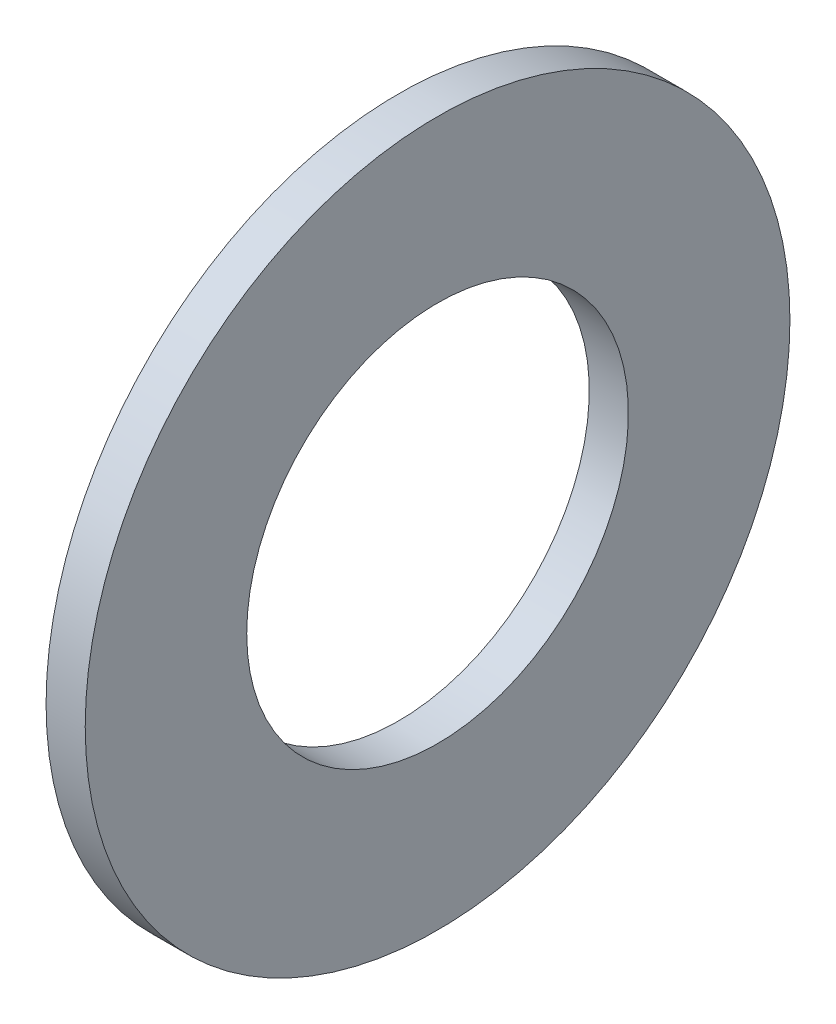
ISO-10303-21;
HEADER;
FILE_DESCRIPTION(('STEP AP214'),'2;1');
FILE_NAME('part.step','',(''),(''),'','','');
FILE_SCHEMA(('AUTOMOTIVE_DESIGN { 1 0 10303 214 1 1 1 1 }'));
ENDSEC;
DATA;
#1=APPLICATION_CONTEXT('core data for automotive mechanical design processes');
#2=APPLICATION_PROTOCOL_DEFINITION('international standard','automotive_design',2000,#1);
#3=PRODUCT_CONTEXT('',#1,'mechanical');
#4=PRODUCT('Part','Part','',(#3));
#5=PRODUCT_RELATED_PRODUCT_CATEGORY('part','',(#4));
#6=PRODUCT_DEFINITION_FORMATION('','',#4);
#7=PRODUCT_DEFINITION_CONTEXT('part definition',#1,'design');
#8=PRODUCT_DEFINITION('design','',#6,#7);
#9=PRODUCT_DEFINITION_SHAPE('','',#8);
#10=(LENGTH_UNIT() NAMED_UNIT(*) SI_UNIT(.MILLI.,.METRE.));
#11=(NAMED_UNIT(*) PLANE_ANGLE_UNIT() SI_UNIT($,.RADIAN.));
#12=(NAMED_UNIT(*) SI_UNIT($,.STERADIAN.) SOLID_ANGLE_UNIT());
#13=UNCERTAINTY_MEASURE_WITH_UNIT(LENGTH_MEASURE(1.E-05),#10,'distance_accuracy_value','');
#14=(GEOMETRIC_REPRESENTATION_CONTEXT(3) GLOBAL_UNCERTAINTY_ASSIGNED_CONTEXT((#13)) GLOBAL_UNIT_ASSIGNED_CONTEXT((#10,
#11,#12)) REPRESENTATION_CONTEXT('',''));
#15=CARTESIAN_POINT('',(0.,0.,0.));
#16=DIRECTION('',(0.,0.,1.));
#17=DIRECTION('',(1.,0.,0.));
#18=AXIS2_PLACEMENT_3D('',#15,#16,#17);
#19=CARTESIAN_POINT('',(-34.9249999999999,0.,0.));
#20=DIRECTION('',(-1.,0.,0.));
#21=DIRECTION('',(0.,0.,1.));
#22=AXIS2_PLACEMENT_3D('',#19,#20,#21);
#23=CYLINDRICAL_SURFACE('',#22,19.5);
#24=CARTESIAN_POINT('',(0.,0.,0.));
#25=DIRECTION('',(-1.,0.,0.));
#26=DIRECTION('',(0.,0.,1.));
#27=AXIS2_PLACEMENT_3D('',#24,#25,#26);
#28=CIRCLE('',#27,19.5);
#29=CARTESIAN_POINT('',(0.,0.,19.5));
#30=VERTEX_POINT('',#29);
#31=EDGE_CURVE('E10',#30,#30,#28,.T.);
#32=ORIENTED_EDGE('',*,*,#31,.F.);
#33=EDGE_LOOP('',(#32));
#34=FACE_BOUND('',#33,.T.);
#35=CARTESIAN_POINT('',(-4.,0.,0.));
#36=DIRECTION('',(-1.,0.,0.));
#37=DIRECTION('',(0.,0.,1.));
#38=AXIS2_PLACEMENT_3D('',#35,#36,#37);
#39=CIRCLE('',#38,19.5);
#40=CARTESIAN_POINT('',(-4.,0.,19.5));
#41=VERTEX_POINT('',#40);
#42=EDGE_CURVE('E44',#41,#41,#39,.T.);
#43=ORIENTED_EDGE('',*,*,#42,.T.);
#44=EDGE_LOOP('',(#43));
#45=FACE_BOUND('',#44,.T.);
#46=ADVANCED_FACE('F30',(#34,#45),#23,.F.);
#47=CARTESIAN_POINT('',(0.,19.5,0.));
#48=DIRECTION('',(-1.,0.,0.));
#49=DIRECTION('',(0.,0.,1.));
#50=AXIS2_PLACEMENT_3D('',#47,#48,#49);
#51=PLANE('',#50);
#52=CARTESIAN_POINT('',(0.,0.,0.));
#53=DIRECTION('',(-1.,0.,0.));
#54=DIRECTION('',(0.,0.,1.));
#55=AXIS2_PLACEMENT_3D('',#52,#53,#54);
#56=CIRCLE('',#55,36.);
#57=CARTESIAN_POINT('',(0.,0.,36.));
#58=VERTEX_POINT('',#57);
#59=EDGE_CURVE('E36',#58,#58,#56,.T.);
#60=ORIENTED_EDGE('',*,*,#59,.F.);
#61=EDGE_LOOP('',(#60));
#62=FACE_BOUND('',#61,.T.);
#63=ORIENTED_EDGE('',*,*,#31,.T.);
#64=EDGE_LOOP('',(#63));
#65=FACE_BOUND('',#64,.T.);
#66=ADVANCED_FACE('F59',(#62,#65),#51,.F.);
#67=CARTESIAN_POINT('',(-34.9249999999999,0.,0.));
#68=DIRECTION('',(-1.,0.,0.));
#69=DIRECTION('',(0.,0.,1.));
#70=AXIS2_PLACEMENT_3D('',#67,#68,#69);
#71=CYLINDRICAL_SURFACE('',#70,36.);
#72=CARTESIAN_POINT('',(-4.,0.,0.));
#73=DIRECTION('',(-1.,0.,0.));
#74=DIRECTION('',(0.,0.,1.));
#75=AXIS2_PLACEMENT_3D('',#72,#73,#74);
#76=CIRCLE('',#75,36.);
#77=CARTESIAN_POINT('',(-4.,0.,36.));
#78=VERTEX_POINT('',#77);
#79=EDGE_CURVE('E40',#78,#78,#76,.T.);
#80=ORIENTED_EDGE('',*,*,#79,.F.);
#81=EDGE_LOOP('',(#80));
#82=FACE_BOUND('',#81,.T.);
#83=ORIENTED_EDGE('',*,*,#59,.T.);
#84=EDGE_LOOP('',(#83));
#85=FACE_BOUND('',#84,.T.);
#86=ADVANCED_FACE('F54',(#82,#85),#71,.T.);
#87=CARTESIAN_POINT('',(-4.,36.,0.));
#88=DIRECTION('',(1.,0.,0.));
#89=DIRECTION('',(0.,0.,-1.));
#90=AXIS2_PLACEMENT_3D('',#87,#88,#89);
#91=PLANE('',#90);
#92=ORIENTED_EDGE('',*,*,#42,.F.);
#93=EDGE_LOOP('',(#92));
#94=FACE_BOUND('',#93,.T.);
#95=ORIENTED_EDGE('',*,*,#79,.T.);
#96=EDGE_LOOP('',(#95));
#97=FACE_BOUND('',#96,.T.);
#98=ADVANCED_FACE('F51',(#94,#97),#91,.F.);
#99=CLOSED_SHELL('',(#46,#66,#86,#98));
#100=MANIFOLD_SOLID_BREP('B2',#99);
#101=ADVANCED_BREP_SHAPE_REPRESENTATION('',(#18,#100),#14);
#102=SHAPE_DEFINITION_REPRESENTATION(#9,#101);
ENDSEC;
END-ISO-10303-21;
